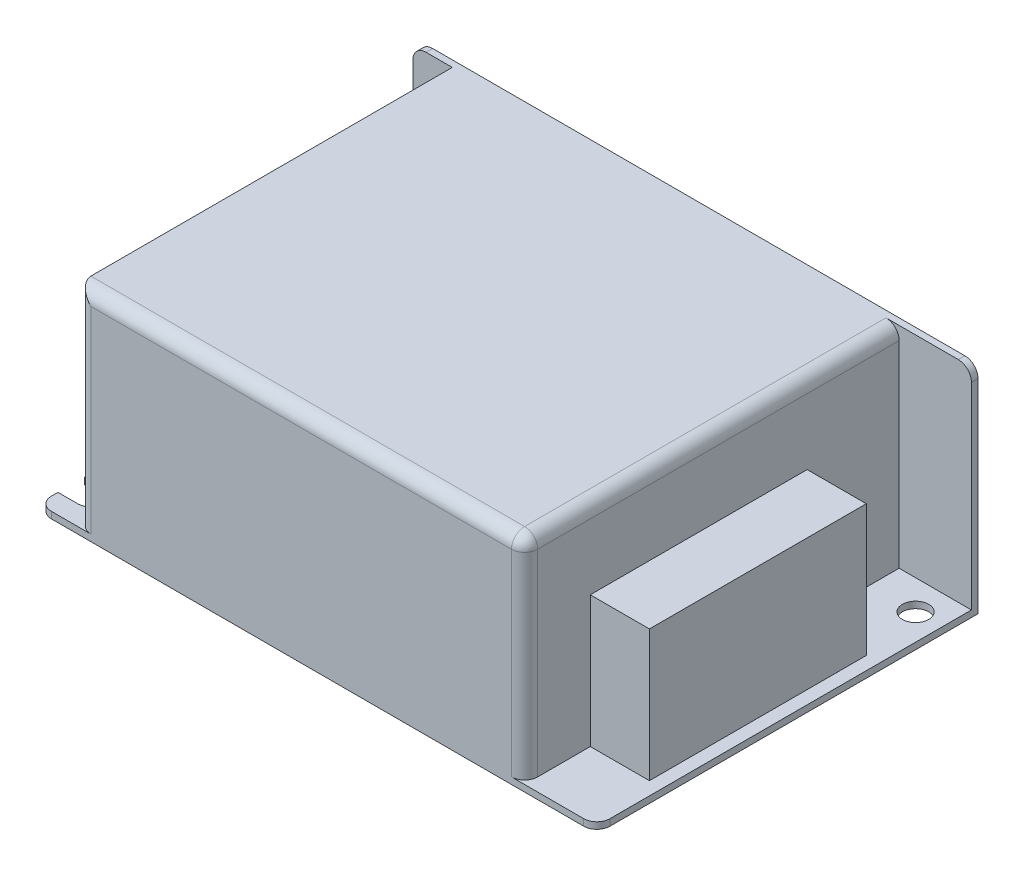
ISO-10303-21;
HEADER;
FILE_DESCRIPTION(('STEP AP214'),'2;1');
FILE_NAME('part.step','',(''),(''),'','','');
FILE_SCHEMA(('AUTOMOTIVE_DESIGN { 1 0 10303 214 1 1 1 1 }'));
ENDSEC;
DATA;
#1=APPLICATION_CONTEXT('core data for automotive mechanical design processes');
#2=APPLICATION_PROTOCOL_DEFINITION('international standard','automotive_design',2000,#1);
#3=PRODUCT_CONTEXT('',#1,'mechanical');
#4=PRODUCT('Part','Part','',(#3));
#5=PRODUCT_RELATED_PRODUCT_CATEGORY('part','',(#4));
#6=PRODUCT_DEFINITION_FORMATION('','',#4);
#7=PRODUCT_DEFINITION_CONTEXT('part definition',#1,'design');
#8=PRODUCT_DEFINITION('design','',#6,#7);
#9=PRODUCT_DEFINITION_SHAPE('','',#8);
#10=(LENGTH_UNIT() NAMED_UNIT(*) SI_UNIT(.MILLI.,.METRE.));
#11=(NAMED_UNIT(*) PLANE_ANGLE_UNIT() SI_UNIT($,.RADIAN.));
#12=(NAMED_UNIT(*) SI_UNIT($,.STERADIAN.) SOLID_ANGLE_UNIT());
#13=UNCERTAINTY_MEASURE_WITH_UNIT(LENGTH_MEASURE(1.E-05),#10,'distance_accuracy_value','');
#14=(GEOMETRIC_REPRESENTATION_CONTEXT(3) GLOBAL_UNCERTAINTY_ASSIGNED_CONTEXT((#13)) GLOBAL_UNIT_ASSIGNED_CONTEXT((#10,
#11,#12)) REPRESENTATION_CONTEXT('',''));
#15=CARTESIAN_POINT('',(0.,0.,0.));
#16=DIRECTION('',(0.,0.,1.));
#17=DIRECTION('',(1.,0.,0.));
#18=AXIS2_PLACEMENT_3D('',#15,#16,#17);
#19=CARTESIAN_POINT('',(-42.5,33.,29.));
#20=DIRECTION('',(1.,0.,0.));
#21=DIRECTION('',(0.,0.,-1.));
#22=AXIS2_PLACEMENT_3D('',#19,#20,#21);
#23=PLANE('',#22);
#24=DIRECTION('',(0.,1.,0.));
#25=VECTOR('',#24,1.);
#26=CARTESIAN_POINT('',(-42.5,-57.3149195236284,-28.));
#27=LINE('',#26,#25);
#28=CARTESIAN_POINT('',(-42.5,1.,-28.));
#29=VERTEX_POINT('',#28);
#30=CARTESIAN_POINT('',(-42.5,31.,-28.));
#31=VERTEX_POINT('',#30);
#32=EDGE_CURVE('E289',#29,#31,#27,.T.);
#33=ORIENTED_EDGE('',*,*,#32,.T.);
#34=DIRECTION('',(0.,0.,1.));
#35=VECTOR('',#34,1.);
#36=CARTESIAN_POINT('',(-42.5,31.,29.));
#37=LINE('',#36,#35);
#38=CARTESIAN_POINT('',(-42.5,31.,-29.));
#39=VERTEX_POINT('',#38);
#40=EDGE_CURVE('E58',#31,#39,#37,.F.);
#41=ORIENTED_EDGE('',*,*,#40,.T.);
#42=DIRECTION('',(0.,-1.,0.));
#43=VECTOR('',#42,1.);
#44=CARTESIAN_POINT('',(-42.5,33.,-29.));
#45=LINE('',#44,#43);
#46=CARTESIAN_POINT('',(-42.5,0.,-29.));
#47=VERTEX_POINT('',#46);
#48=EDGE_CURVE('E318',#39,#47,#45,.T.);
#49=ORIENTED_EDGE('',*,*,#48,.T.);
#50=DIRECTION('',(0.,0.,1.));
#51=VECTOR('',#50,1.);
#52=CARTESIAN_POINT('',(-42.5,0.,29.));
#53=LINE('',#52,#51);
#54=CARTESIAN_POINT('',(-42.5,0.,22.));
#55=VERTEX_POINT('',#54);
#56=EDGE_CURVE('E326',#47,#55,#53,.T.);
#57=ORIENTED_EDGE('',*,*,#56,.T.);
#58=DIRECTION('',(0.,-1.,0.));
#59=VECTOR('',#58,1.);
#60=CARTESIAN_POINT('',(-42.5,33.001,22.));
#61=LINE('',#60,#59);
#62=CARTESIAN_POINT('',(-42.5,1.,22.));
#63=VERTEX_POINT('',#62);
#64=EDGE_CURVE('E228',#63,#55,#61,.T.);
#65=ORIENTED_EDGE('',*,*,#64,.F.);
#66=DIRECTION('',(0.,0.,1.));
#67=VECTOR('',#66,1.);
#68=CARTESIAN_POINT('',(-42.5,1.,29.));
#69=LINE('',#68,#67);
#70=EDGE_CURVE('E235',#29,#63,#69,.T.);
#71=ORIENTED_EDGE('',*,*,#70,.F.);
#72=EDGE_LOOP('',(#33,#41,#49,#57,#65,#71));
#73=FACE_BOUND('',#72,.T.);
#74=ADVANCED_FACE('F41',(#73),#23,.F.);
#75=CARTESIAN_POINT('',(0.,0.,0.));
#76=DIRECTION('',(0.,-1.,0.));
#77=DIRECTION('',(0.,0.,-1.));
#78=AXIS2_PLACEMENT_3D('',#75,#76,#77);
#79=PLANE('',#78);
#80=CARTESIAN_POINT('',(38.5,0.,-23.5));
#81=DIRECTION('',(0.,-1.,0.));
#82=DIRECTION('',(0.,0.,-1.));
#83=AXIS2_PLACEMENT_3D('',#80,#81,#82);
#84=CIRCLE('',#83,2.);
#85=CARTESIAN_POINT('',(38.5,0.,-25.5));
#86=VERTEX_POINT('',#85);
#87=EDGE_CURVE('E245',#86,#86,#84,.T.);
#88=ORIENTED_EDGE('',*,*,#87,.F.);
#89=EDGE_LOOP('',(#88));
#90=FACE_BOUND('',#89,.T.);
#91=DIRECTION('',(0.,0.,-1.));
#92=VECTOR('',#91,1.);
#93=CARTESIAN_POINT('',(42.5,0.,29.));
#94=LINE('',#93,#92);
#95=CARTESIAN_POINT('',(42.5,0.,27.));
#96=VERTEX_POINT('',#95);
#97=CARTESIAN_POINT('',(42.5,0.,-29.));
#98=VERTEX_POINT('',#97);
#99=EDGE_CURVE('E314',#96,#98,#94,.T.);
#100=ORIENTED_EDGE('',*,*,#99,.F.);
#101=CARTESIAN_POINT('',(40.5,0.,27.));
#102=DIRECTION('',(0.,-1.,0.));
#103=DIRECTION('',(0.,0.,-1.));
#104=AXIS2_PLACEMENT_3D('',#101,#102,#103);
#105=CIRCLE('',#104,2.);
#106=CARTESIAN_POINT('',(40.5,0.,29.));
#107=VERTEX_POINT('',#106);
#108=EDGE_CURVE('E341',#96,#107,#105,.T.);
#109=ORIENTED_EDGE('',*,*,#108,.T.);
#110=DIRECTION('',(1.,0.,0.));
#111=VECTOR('',#110,1.);
#112=CARTESIAN_POINT('',(-42.5,0.,29.));
#113=LINE('',#112,#111);
#114=CARTESIAN_POINT('',(-40.5,0.,29.));
#115=VERTEX_POINT('',#114);
#116=EDGE_CURVE('E319',#115,#107,#113,.T.);
#117=ORIENTED_EDGE('',*,*,#116,.F.);
#118=CARTESIAN_POINT('',(-40.5,0.,27.));
#119=DIRECTION('',(0.,-1.,0.));
#120=DIRECTION('',(0.,0.,-1.));
#121=AXIS2_PLACEMENT_3D('',#118,#119,#120);
#122=CIRCLE('',#121,2.);
#123=CARTESIAN_POINT('',(-42.5,0.,27.));
#124=VERTEX_POINT('',#123);
#125=EDGE_CURVE('E339',#115,#124,#122,.T.);
#126=ORIENTED_EDGE('',*,*,#125,.T.);
#127=CARTESIAN_POINT('',(-42.5,0.,26.));
#128=VERTEX_POINT('',#127);
#129=EDGE_CURVE('E325',#128,#124,#53,.T.);
#130=ORIENTED_EDGE('',*,*,#129,.F.);
#131=DIRECTION('',(-1.,0.,0.));
#132=VECTOR('',#131,1.);
#133=CARTESIAN_POINT('',(-39.5,0.,26.));
#134=LINE('',#133,#132);
#135=CARTESIAN_POINT('',(-39.5,0.,26.));
#136=VERTEX_POINT('',#135);
#137=EDGE_CURVE('E238',#136,#128,#134,.T.);
#138=ORIENTED_EDGE('',*,*,#137,.F.);
#139=CARTESIAN_POINT('',(-39.5,0.,24.));
#140=DIRECTION('',(0.,-1.,0.));
#141=DIRECTION('',(0.,0.,-1.));
#142=AXIS2_PLACEMENT_3D('',#139,#140,#141);
#143=CIRCLE('',#142,2.);
#144=CARTESIAN_POINT('',(-39.5,0.,22.));
#145=VERTEX_POINT('',#144);
#146=EDGE_CURVE('E236',#145,#136,#143,.T.);
#147=ORIENTED_EDGE('',*,*,#146,.F.);
#148=DIRECTION('',(-1.,0.,0.));
#149=VECTOR('',#148,1.);
#150=CARTESIAN_POINT('',(-39.5,0.,22.));
#151=LINE('',#150,#149);
#152=EDGE_CURVE('E215',#145,#55,#151,.T.);
#153=ORIENTED_EDGE('',*,*,#152,.T.);
#154=ORIENTED_EDGE('',*,*,#56,.F.);
#155=DIRECTION('',(-1.,0.,0.));
#156=VECTOR('',#155,1.);
#157=CARTESIAN_POINT('',(-42.5,0.,-29.));
#158=LINE('',#157,#156);
#159=EDGE_CURVE('E322',#98,#47,#158,.T.);
#160=ORIENTED_EDGE('',*,*,#159,.F.);
#161=EDGE_LOOP('',(#100,#109,#117,#126,#130,#138,#147,#153,#154,#160));
#162=FACE_BOUND('',#161,.T.);
#163=ADVANCED_FACE('F419',(#90,#162),#79,.T.);
#164=CARTESIAN_POINT('',(0.,1.,0.));
#165=DIRECTION('',(0.,-1.,0.));
#166=DIRECTION('',(0.,0.,-1.));
#167=AXIS2_PLACEMENT_3D('',#164,#165,#166);
#168=PLANE('',#167);
#169=CARTESIAN_POINT('',(-42.5,1.,26.));
#170=VERTEX_POINT('',#169);
#171=CARTESIAN_POINT('',(-42.5,1.,27.));
#172=VERTEX_POINT('',#171);
#173=EDGE_CURVE('E286',#170,#172,#69,.T.);
#174=ORIENTED_EDGE('',*,*,#173,.T.);
#175=CARTESIAN_POINT('',(-40.5,1.,27.));
#176=DIRECTION('',(0.,-1.,0.));
#177=DIRECTION('',(0.,0.,-1.));
#178=AXIS2_PLACEMENT_3D('',#175,#176,#177);
#179=CIRCLE('',#178,2.);
#180=CARTESIAN_POINT('',(-40.5,1.,29.));
#181=VERTEX_POINT('',#180);
#182=EDGE_CURVE('E359',#172,#181,#179,.F.);
#183=ORIENTED_EDGE('',*,*,#182,.T.);
#184=DIRECTION('',(1.,0.,0.));
#185=VECTOR('',#184,1.);
#186=CARTESIAN_POINT('',(-42.5,1.,29.));
#187=LINE('',#186,#185);
#188=CARTESIAN_POINT('',(-34.5,1.,29.));
#189=VERTEX_POINT('',#188);
#190=EDGE_CURVE('E280',#181,#189,#187,.T.);
#191=ORIENTED_EDGE('',*,*,#190,.T.);
#192=CARTESIAN_POINT('',(-34.5,1.,27.));
#193=DIRECTION('',(0.,-1.,0.));
#194=DIRECTION('',(0.,0.,-1.));
#195=AXIS2_PLACEMENT_3D('',#192,#193,#194);
#196=CIRCLE('',#195,2.);
#197=CARTESIAN_POINT('',(-36.5,1.,27.));
#198=VERTEX_POINT('',#197);
#199=EDGE_CURVE('E387',#189,#198,#196,.T.);
#200=ORIENTED_EDGE('',*,*,#199,.T.);
#201=DIRECTION('',(0.,0.,-1.));
#202=VECTOR('',#201,1.);
#203=CARTESIAN_POINT('',(-36.5,1.,29.));
#204=LINE('',#203,#202);
#205=CARTESIAN_POINT('',(-36.5,1.,-28.));
#206=VERTEX_POINT('',#205);
#207=EDGE_CURVE('E283',#198,#206,#204,.T.);
#208=ORIENTED_EDGE('',*,*,#207,.T.);
#209=DIRECTION('',(-1.,0.,0.));
#210=VECTOR('',#209,1.);
#211=CARTESIAN_POINT('',(-42.5,1.,-28.));
#212=LINE('',#211,#210);
#213=EDGE_CURVE('E287',#206,#29,#212,.T.);
#214=ORIENTED_EDGE('',*,*,#213,.T.);
#215=ORIENTED_EDGE('',*,*,#70,.T.);
#216=DIRECTION('',(1.,0.,0.));
#217=VECTOR('',#216,1.);
#218=CARTESIAN_POINT('',(-39.5,1.,22.));
#219=LINE('',#218,#217);
#220=CARTESIAN_POINT('',(-39.5,1.,22.));
#221=VERTEX_POINT('',#220);
#222=EDGE_CURVE('E212',#63,#221,#219,.T.);
#223=ORIENTED_EDGE('',*,*,#222,.T.);
#224=CARTESIAN_POINT('',(-39.5,1.,24.));
#225=DIRECTION('',(0.,-1.,0.));
#226=DIRECTION('',(0.,0.,-1.));
#227=AXIS2_PLACEMENT_3D('',#224,#225,#226);
#228=CIRCLE('',#227,2.);
#229=CARTESIAN_POINT('',(-39.5,1.,26.));
#230=VERTEX_POINT('',#229);
#231=EDGE_CURVE('E223',#230,#221,#228,.F.);
#232=ORIENTED_EDGE('',*,*,#231,.F.);
#233=DIRECTION('',(1.,0.,0.));
#234=VECTOR('',#233,1.);
#235=CARTESIAN_POINT('',(-39.5,1.,26.));
#236=LINE('',#235,#234);
#237=EDGE_CURVE('E220',#170,#230,#236,.T.);
#238=ORIENTED_EDGE('',*,*,#237,.F.);
#239=EDGE_LOOP('',(#174,#183,#191,#200,#208,#214,#215,#223,#232,#238));
#240=FACE_BOUND('',#239,.T.);
#241=ADVANCED_FACE('F232',(#240),#168,.F.);
#242=CARTESIAN_POINT('',(0.,1.,0.));
#243=DIRECTION('',(0.,-1.,0.));
#244=DIRECTION('',(0.,0.,-1.));
#245=AXIS2_PLACEMENT_3D('',#242,#243,#244);
#246=PLANE('',#245);
#247=CARTESIAN_POINT('',(38.5,1.,-23.5));
#248=DIRECTION('',(0.,-1.,0.));
#249=DIRECTION('',(0.,0.,-1.));
#250=AXIS2_PLACEMENT_3D('',#247,#248,#249);
#251=CIRCLE('',#250,2.);
#252=CARTESIAN_POINT('',(38.5,1.,-25.5));
#253=VERTEX_POINT('',#252);
#254=EDGE_CURVE('E262',#253,#253,#251,.F.);
#255=ORIENTED_EDGE('',*,*,#254,.F.);
#256=EDGE_LOOP('',(#255));
#257=FACE_BOUND('',#256,.T.);
#258=DIRECTION('',(1.,0.,0.));
#259=VECTOR('',#258,1.);
#260=CARTESIAN_POINT('',(42.5,1.,29.));
#261=LINE('',#260,#259);
#262=CARTESIAN_POINT('',(29.5,1.,29.));
#263=VERTEX_POINT('',#262);
#264=CARTESIAN_POINT('',(40.5,1.,29.));
#265=VERTEX_POINT('',#264);
#266=EDGE_CURVE('E303',#263,#265,#261,.T.);
#267=ORIENTED_EDGE('',*,*,#266,.T.);
#268=CARTESIAN_POINT('',(40.5,1.,27.));
#269=DIRECTION('',(0.,-1.,0.));
#270=DIRECTION('',(0.,0.,-1.));
#271=AXIS2_PLACEMENT_3D('',#268,#269,#270);
#272=CIRCLE('',#271,2.);
#273=CARTESIAN_POINT('',(42.5,1.,27.));
#274=VERTEX_POINT('',#273);
#275=EDGE_CURVE('E355',#265,#274,#272,.F.);
#276=ORIENTED_EDGE('',*,*,#275,.T.);
#277=DIRECTION('',(0.,0.,-1.));
#278=VECTOR('',#277,1.);
#279=CARTESIAN_POINT('',(42.5,1.,29.));
#280=LINE('',#279,#278);
#281=CARTESIAN_POINT('',(42.5,1.,-28.));
#282=VERTEX_POINT('',#281);
#283=EDGE_CURVE('E300',#274,#282,#280,.T.);
#284=ORIENTED_EDGE('',*,*,#283,.T.);
#285=DIRECTION('',(-1.,0.,0.));
#286=VECTOR('',#285,1.);
#287=CARTESIAN_POINT('',(42.5,1.,-28.));
#288=LINE('',#287,#286);
#289=CARTESIAN_POINT('',(31.5,1.,-28.));
#290=VERTEX_POINT('',#289);
#291=EDGE_CURVE('E296',#282,#290,#288,.T.);
#292=ORIENTED_EDGE('',*,*,#291,.T.);
#293=DIRECTION('',(0.,0.,1.));
#294=VECTOR('',#293,1.);
#295=CARTESIAN_POINT('',(31.5,1.,29.));
#296=LINE('',#295,#294);
#297=CARTESIAN_POINT('',(31.5,1.,-14.));
#298=VERTEX_POINT('',#297);
#299=EDGE_CURVE('E306',#290,#298,#296,.T.);
#300=ORIENTED_EDGE('',*,*,#299,.T.);
#301=DIRECTION('',(-1.,0.,0.));
#302=VECTOR('',#301,1.);
#303=CARTESIAN_POINT('',(31.5,1.,-14.));
#304=LINE('',#303,#302);
#305=CARTESIAN_POINT('',(40.5,1.,-14.));
#306=VERTEX_POINT('',#305);
#307=EDGE_CURVE('E250',#306,#298,#304,.T.);
#308=ORIENTED_EDGE('',*,*,#307,.F.);
#309=DIRECTION('',(0.,0.,-1.));
#310=VECTOR('',#309,1.);
#311=CARTESIAN_POINT('',(40.5,1.,19.));
#312=LINE('',#311,#310);
#313=CARTESIAN_POINT('',(40.5,1.,19.));
#314=VERTEX_POINT('',#313);
#315=EDGE_CURVE('E261',#314,#306,#312,.T.);
#316=ORIENTED_EDGE('',*,*,#315,.F.);
#317=DIRECTION('',(1.,0.,0.));
#318=VECTOR('',#317,1.);
#319=CARTESIAN_POINT('',(31.5,1.,19.));
#320=LINE('',#319,#318);
#321=CARTESIAN_POINT('',(31.5,1.,19.));
#322=VERTEX_POINT('',#321);
#323=EDGE_CURVE('E258',#322,#314,#320,.T.);
#324=ORIENTED_EDGE('',*,*,#323,.F.);
#325=CARTESIAN_POINT('',(31.5,1.,27.));
#326=VERTEX_POINT('',#325);
#327=EDGE_CURVE('E309',#322,#326,#296,.T.);
#328=ORIENTED_EDGE('',*,*,#327,.T.);
#329=CARTESIAN_POINT('',(29.5,1.,27.));
#330=DIRECTION('',(0.,-1.,0.));
#331=DIRECTION('',(0.,0.,-1.));
#332=AXIS2_PLACEMENT_3D('',#329,#330,#331);
#333=CIRCLE('',#332,2.);
#334=EDGE_CURVE('E50',#326,#263,#333,.T.);
#335=ORIENTED_EDGE('',*,*,#334,.T.);
#336=EDGE_LOOP('',(#267,#276,#284,#292,#300,#308,#316,#324,#328,#335));
#337=FACE_BOUND('',#336,.T.);
#338=ADVANCED_FACE('F463',(#257,#337),#246,.F.);
#339=CARTESIAN_POINT('',(31.5,-58.0517010948,29.));
#340=DIRECTION('',(-1.,0.,0.));
#341=DIRECTION('',(0.,0.,1.));
#342=AXIS2_PLACEMENT_3D('',#339,#340,#341);
#343=PLANE('',#342);
#344=DIRECTION('',(0.,0.,1.));
#345=VECTOR('',#344,1.);
#346=CARTESIAN_POINT('',(31.5,31.,29.));
#347=LINE('',#346,#345);
#348=CARTESIAN_POINT('',(31.5,31.,-28.));
#349=VERTEX_POINT('',#348);
#350=CARTESIAN_POINT('',(31.5,31.,27.));
#351=VERTEX_POINT('',#350);
#352=EDGE_CURVE('E364',#349,#351,#347,.T.);
#353=ORIENTED_EDGE('',*,*,#352,.T.);
#354=DIRECTION('',(0.,1.,0.));
#355=VECTOR('',#354,1.);
#356=CARTESIAN_POINT('',(31.5,-58.0517010948,27.));
#357=LINE('',#356,#355);
#358=EDGE_CURVE('E366',#351,#326,#357,.F.);
#359=ORIENTED_EDGE('',*,*,#358,.T.);
#360=ORIENTED_EDGE('',*,*,#327,.F.);
#361=DIRECTION('',(0.,-1.,0.));
#362=VECTOR('',#361,1.);
#363=CARTESIAN_POINT('',(31.5,21.,19.));
#364=LINE('',#363,#362);
#365=CARTESIAN_POINT('',(31.5,21.,19.));
#366=VERTEX_POINT('',#365);
#367=EDGE_CURVE('E274',#366,#322,#364,.T.);
#368=ORIENTED_EDGE('',*,*,#367,.F.);
#369=DIRECTION('',(0.,0.,1.));
#370=VECTOR('',#369,1.);
#371=CARTESIAN_POINT('',(31.5,21.,19.));
#372=LINE('',#371,#370);
#373=CARTESIAN_POINT('',(31.5,21.,-14.));
#374=VERTEX_POINT('',#373);
#375=EDGE_CURVE('E246',#374,#366,#372,.T.);
#376=ORIENTED_EDGE('',*,*,#375,.F.);
#377=DIRECTION('',(0.,-1.,0.));
#378=VECTOR('',#377,1.);
#379=CARTESIAN_POINT('',(31.5,21.,-14.));
#380=LINE('',#379,#378);
#381=EDGE_CURVE('E257',#374,#298,#380,.T.);
#382=ORIENTED_EDGE('',*,*,#381,.T.);
#383=ORIENTED_EDGE('',*,*,#299,.F.);
#384=DIRECTION('',(0.,1.,0.));
#385=VECTOR('',#384,1.);
#386=CARTESIAN_POINT('',(31.5,-58.0517010948,-28.));
#387=LINE('',#386,#385);
#388=EDGE_CURVE('E299',#290,#349,#387,.T.);
#389=ORIENTED_EDGE('',*,*,#388,.T.);
#390=EDGE_LOOP('',(#353,#359,#360,#368,#376,#382,#383,#389));
#391=FACE_BOUND('',#390,.T.);
#392=ADVANCED_FACE('F459',(#391),#343,.F.);
#393=CARTESIAN_POINT('',(42.5,33.,29.));
#394=DIRECTION('',(-1.,0.,0.));
#395=DIRECTION('',(0.,0.,1.));
#396=AXIS2_PLACEMENT_3D('',#393,#394,#395);
#397=PLANE('',#396);
#398=ORIENTED_EDGE('',*,*,#283,.F.);
#399=DIRECTION('',(0.,-1.,0.));
#400=VECTOR('',#399,1.);
#401=CARTESIAN_POINT('',(42.5,33.,27.));
#402=LINE('',#401,#400);
#403=EDGE_CURVE('E336',#274,#96,#402,.T.);
#404=ORIENTED_EDGE('',*,*,#403,.T.);
#405=ORIENTED_EDGE('',*,*,#99,.T.);
#406=DIRECTION('',(0.,-1.,0.));
#407=VECTOR('',#406,1.);
#408=CARTESIAN_POINT('',(42.5,33.,-29.));
#409=LINE('',#408,#407);
#410=CARTESIAN_POINT('',(42.5,31.,-29.));
#411=VERTEX_POINT('',#410);
#412=EDGE_CURVE('E332',#411,#98,#409,.T.);
#413=ORIENTED_EDGE('',*,*,#412,.F.);
#414=DIRECTION('',(0.,0.,-1.));
#415=VECTOR('',#414,1.);
#416=CARTESIAN_POINT('',(42.5,31.,29.));
#417=LINE('',#416,#415);
#418=CARTESIAN_POINT('',(42.5,31.,-28.));
#419=VERTEX_POINT('',#418);
#420=EDGE_CURVE('E334',#411,#419,#417,.F.);
#421=ORIENTED_EDGE('',*,*,#420,.T.);
#422=DIRECTION('',(0.,1.,0.));
#423=VECTOR('',#422,1.);
#424=CARTESIAN_POINT('',(42.5,-58.0517010948,-28.));
#425=LINE('',#424,#423);
#426=EDGE_CURVE('E302',#282,#419,#425,.T.);
#427=ORIENTED_EDGE('',*,*,#426,.F.);
#428=EDGE_LOOP('',(#398,#404,#405,#413,#421,#427));
#429=FACE_BOUND('',#428,.T.);
#430=ADVANCED_FACE('F487',(#429),#397,.F.);
#431=CARTESIAN_POINT('',(-42.5,33.,-29.));
#432=DIRECTION('',(0.,0.,1.));
#433=DIRECTION('',(1.,0.,0.));
#434=AXIS2_PLACEMENT_3D('',#431,#432,#433);
#435=PLANE('',#434);
#436=ORIENTED_EDGE('',*,*,#48,.F.);
#437=CARTESIAN_POINT('',(-40.5,31.,-29.));
#438=DIRECTION('',(0.,0.,1.));
#439=DIRECTION('',(1.,0.,0.));
#440=AXIS2_PLACEMENT_3D('',#437,#438,#439);
#441=CIRCLE('',#440,2.);
#442=CARTESIAN_POINT('',(-40.5,33.,-29.));
#443=VERTEX_POINT('',#442);
#444=EDGE_CURVE('E383',#39,#443,#441,.F.);
#445=ORIENTED_EDGE('',*,*,#444,.T.);
#446=DIRECTION('',(-1.,0.,0.));
#447=VECTOR('',#446,1.);
#448=CARTESIAN_POINT('',(-42.5,33.,-29.));
#449=LINE('',#448,#447);
#450=CARTESIAN_POINT('',(40.5,33.,-29.));
#451=VERTEX_POINT('',#450);
#452=EDGE_CURVE('E315',#451,#443,#449,.T.);
#453=ORIENTED_EDGE('',*,*,#452,.F.);
#454=CARTESIAN_POINT('',(40.5,31.,-29.));
#455=DIRECTION('',(0.,0.,1.));
#456=DIRECTION('',(1.,0.,0.));
#457=AXIS2_PLACEMENT_3D('',#454,#455,#456);
#458=CIRCLE('',#457,2.);
#459=EDGE_CURVE('E381',#451,#411,#458,.F.);
#460=ORIENTED_EDGE('',*,*,#459,.T.);
#461=ORIENTED_EDGE('',*,*,#412,.T.);
#462=ORIENTED_EDGE('',*,*,#159,.T.);
#463=EDGE_LOOP('',(#436,#445,#453,#460,#461,#462));
#464=FACE_BOUND('',#463,.T.);
#465=ADVANCED_FACE('F493',(#464),#435,.F.);
#466=ORIENTED_EDGE('',*,*,#129,.T.);
#467=DIRECTION('',(0.,-1.,0.));
#468=VECTOR('',#467,1.);
#469=CARTESIAN_POINT('',(-42.5,33.,27.));
#470=LINE('',#469,#468);
#471=EDGE_CURVE('E357',#124,#172,#470,.F.);
#472=ORIENTED_EDGE('',*,*,#471,.T.);
#473=ORIENTED_EDGE('',*,*,#173,.F.);
#474=DIRECTION('',(0.,1.,0.));
#475=VECTOR('',#474,1.);
#476=CARTESIAN_POINT('',(-42.5,33.001,26.));
#477=LINE('',#476,#475);
#478=EDGE_CURVE('E243',#128,#170,#477,.T.);
#479=ORIENTED_EDGE('',*,*,#478,.F.);
#480=EDGE_LOOP('',(#466,#472,#473,#479));
#481=FACE_BOUND('',#480,.T.);
#482=ADVANCED_FACE('F416',(#481),#23,.F.);
#483=CARTESIAN_POINT('',(-42.5,33.,29.));
#484=DIRECTION('',(0.,0.,-1.));
#485=DIRECTION('',(-1.,0.,0.));
#486=AXIS2_PLACEMENT_3D('',#483,#484,#485);
#487=PLANE('',#486);
#488=ORIENTED_EDGE('',*,*,#116,.T.);
#489=DIRECTION('',(0.,-1.,0.));
#490=VECTOR('',#489,1.);
#491=CARTESIAN_POINT('',(40.5,33.,29.));
#492=LINE('',#491,#490);
#493=EDGE_CURVE('E353',#107,#265,#492,.F.);
#494=ORIENTED_EDGE('',*,*,#493,.T.);
#495=ORIENTED_EDGE('',*,*,#266,.F.);
#496=DIRECTION('',(0.,1.,0.));
#497=VECTOR('',#496,1.);
#498=CARTESIAN_POINT('',(29.5,33.,29.));
#499=LINE('',#498,#497);
#500=CARTESIAN_POINT('',(29.5,31.,29.));
#501=VERTEX_POINT('',#500);
#502=EDGE_CURVE('E345',#263,#501,#499,.T.);
#503=ORIENTED_EDGE('',*,*,#502,.T.);
#504=DIRECTION('',(1.,0.,0.));
#505=VECTOR('',#504,1.);
#506=CARTESIAN_POINT('',(-42.5,31.,29.));
#507=LINE('',#506,#505);
#508=CARTESIAN_POINT('',(-34.5,31.,29.));
#509=VERTEX_POINT('',#508);
#510=EDGE_CURVE('E343',#501,#509,#507,.F.);
#511=ORIENTED_EDGE('',*,*,#510,.T.);
#512=DIRECTION('',(0.,1.,0.));
#513=VECTOR('',#512,1.);
#514=CARTESIAN_POINT('',(-34.5,33.,29.));
#515=LINE('',#514,#513);
#516=EDGE_CURVE('E347',#509,#189,#515,.F.);
#517=ORIENTED_EDGE('',*,*,#516,.T.);
#518=ORIENTED_EDGE('',*,*,#190,.F.);
#519=DIRECTION('',(0.,-1.,0.));
#520=VECTOR('',#519,1.);
#521=CARTESIAN_POINT('',(-40.5,33.,29.));
#522=LINE('',#521,#520);
#523=EDGE_CURVE('E350',#181,#115,#522,.T.);
#524=ORIENTED_EDGE('',*,*,#523,.T.);
#525=EDGE_LOOP('',(#488,#494,#495,#503,#511,#517,#518,#524));
#526=FACE_BOUND('',#525,.T.);
#527=ADVANCED_FACE('F427',(#526),#487,.F.);
#528=CARTESIAN_POINT('',(0.,33.,0.));
#529=DIRECTION('',(0.,-1.,0.));
#530=DIRECTION('',(0.,0.,-1.));
#531=AXIS2_PLACEMENT_3D('',#528,#529,#530);
#532=PLANE('',#531);
#533=DIRECTION('',(0.,0.,-1.));
#534=VECTOR('',#533,1.);
#535=CARTESIAN_POINT('',(-36.5,33.,29.));
#536=LINE('',#535,#534);
#537=CARTESIAN_POINT('',(-36.5,33.,27.));
#538=VERTEX_POINT('',#537);
#539=CARTESIAN_POINT('',(-36.5,33.,-28.));
#540=VERTEX_POINT('',#539);
#541=EDGE_CURVE('E277',#538,#540,#536,.T.);
#542=ORIENTED_EDGE('',*,*,#541,.F.);
#543=DIRECTION('',(1.,0.,0.));
#544=VECTOR('',#543,1.);
#545=CARTESIAN_POINT('',(0.,33.,27.));
#546=LINE('',#545,#544);
#547=CARTESIAN_POINT('',(29.5,33.,27.));
#548=VERTEX_POINT('',#547);
#549=EDGE_CURVE('E377',#538,#548,#546,.T.);
#550=ORIENTED_EDGE('',*,*,#549,.T.);
#551=DIRECTION('',(0.,0.,1.));
#552=VECTOR('',#551,1.);
#553=CARTESIAN_POINT('',(29.5,33.,0.));
#554=LINE('',#553,#552);
#555=CARTESIAN_POINT('',(29.5,33.,-28.));
#556=VERTEX_POINT('',#555);
#557=EDGE_CURVE('E374',#548,#556,#554,.F.);
#558=ORIENTED_EDGE('',*,*,#557,.T.);
#559=DIRECTION('',(-1.,0.,0.));
#560=VECTOR('',#559,1.);
#561=CARTESIAN_POINT('',(42.5,33.,-28.));
#562=LINE('',#561,#560);
#563=CARTESIAN_POINT('',(40.5,33.,-28.));
#564=VERTEX_POINT('',#563);
#565=EDGE_CURVE('E285',#564,#556,#562,.T.);
#566=ORIENTED_EDGE('',*,*,#565,.F.);
#567=DIRECTION('',(0.,0.,-1.));
#568=VECTOR('',#567,1.);
#569=CARTESIAN_POINT('',(40.5,33.,0.));
#570=LINE('',#569,#568);
#571=EDGE_CURVE('E368',#564,#451,#570,.T.);
#572=ORIENTED_EDGE('',*,*,#571,.T.);
#573=ORIENTED_EDGE('',*,*,#452,.T.);
#574=DIRECTION('',(0.,0.,1.));
#575=VECTOR('',#574,1.);
#576=CARTESIAN_POINT('',(-40.5,33.,0.));
#577=LINE('',#576,#575);
#578=CARTESIAN_POINT('',(-40.5,33.,-28.));
#579=VERTEX_POINT('',#578);
#580=EDGE_CURVE('E371',#443,#579,#577,.T.);
#581=ORIENTED_EDGE('',*,*,#580,.T.);
#582=DIRECTION('',(-1.,0.,0.));
#583=VECTOR('',#582,1.);
#584=CARTESIAN_POINT('',(-42.5,33.,-28.));
#585=LINE('',#584,#583);
#586=EDGE_CURVE('E278',#540,#579,#585,.T.);
#587=ORIENTED_EDGE('',*,*,#586,.F.);
#588=EDGE_LOOP('',(#542,#550,#558,#566,#572,#573,#581,#587));
#589=FACE_BOUND('',#588,.T.);
#590=ADVANCED_FACE('F447',(#589),#532,.F.);
#591=CARTESIAN_POINT('',(42.5,-58.0517010948,-28.));
#592=DIRECTION('',(0.,0.,-1.));
#593=DIRECTION('',(-1.,0.,0.));
#594=AXIS2_PLACEMENT_3D('',#591,#592,#593);
#595=PLANE('',#594);
#596=ORIENTED_EDGE('',*,*,#426,.T.);
#597=CARTESIAN_POINT('',(40.5,31.,-28.));
#598=DIRECTION('',(0.,0.,-1.));
#599=DIRECTION('',(-1.,0.,0.));
#600=AXIS2_PLACEMENT_3D('',#597,#598,#599);
#601=CIRCLE('',#600,2.);
#602=EDGE_CURVE('E385',#419,#564,#601,.F.);
#603=ORIENTED_EDGE('',*,*,#602,.T.);
#604=ORIENTED_EDGE('',*,*,#565,.T.);
#605=CARTESIAN_POINT('',(29.5,31.,-28.));
#606=DIRECTION('',(0.,0.,-1.));
#607=DIRECTION('',(-1.,0.,0.));
#608=AXIS2_PLACEMENT_3D('',#605,#606,#607);
#609=CIRCLE('',#608,2.);
#610=EDGE_CURVE('E13',#556,#349,#609,.T.);
#611=ORIENTED_EDGE('',*,*,#610,.T.);
#612=ORIENTED_EDGE('',*,*,#388,.F.);
#613=ORIENTED_EDGE('',*,*,#291,.F.);
#614=EDGE_LOOP('',(#596,#603,#604,#611,#612,#613));
#615=FACE_BOUND('',#614,.T.);
#616=ADVANCED_FACE('F456',(#615),#595,.F.);
#617=CARTESIAN_POINT('',(-36.5,-57.3149195236284,29.));
#618=DIRECTION('',(1.,0.,0.));
#619=DIRECTION('',(0.,0.,-1.));
#620=AXIS2_PLACEMENT_3D('',#617,#618,#619);
#621=PLANE('',#620);
#622=ORIENTED_EDGE('',*,*,#207,.F.);
#623=DIRECTION('',(0.,1.,0.));
#624=VECTOR('',#623,1.);
#625=CARTESIAN_POINT('',(-36.5,-57.3149195236284,27.));
#626=LINE('',#625,#624);
#627=EDGE_CURVE('E361',#198,#538,#626,.T.);
#628=ORIENTED_EDGE('',*,*,#627,.T.);
#629=ORIENTED_EDGE('',*,*,#541,.T.);
#630=DIRECTION('',(0.,1.,0.));
#631=VECTOR('',#630,1.);
#632=CARTESIAN_POINT('',(-36.5,-57.3149195236284,-28.));
#633=LINE('',#632,#631);
#634=EDGE_CURVE('E290',#206,#540,#633,.T.);
#635=ORIENTED_EDGE('',*,*,#634,.F.);
#636=EDGE_LOOP('',(#622,#628,#629,#635));
#637=FACE_BOUND('',#636,.T.);
#638=ADVANCED_FACE('F437',(#637),#621,.F.);
#639=CARTESIAN_POINT('',(-42.5,-57.3149195236284,-28.));
#640=DIRECTION('',(0.,0.,-1.));
#641=DIRECTION('',(-1.,0.,0.));
#642=AXIS2_PLACEMENT_3D('',#639,#640,#641);
#643=PLANE('',#642);
#644=ORIENTED_EDGE('',*,*,#586,.T.);
#645=CARTESIAN_POINT('',(-40.5,31.,-28.));
#646=DIRECTION('',(0.,0.,-1.));
#647=DIRECTION('',(-1.,0.,0.));
#648=AXIS2_PLACEMENT_3D('',#645,#646,#647);
#649=CIRCLE('',#648,2.);
#650=EDGE_CURVE('E66',#579,#31,#649,.F.);
#651=ORIENTED_EDGE('',*,*,#650,.T.);
#652=ORIENTED_EDGE('',*,*,#32,.F.);
#653=ORIENTED_EDGE('',*,*,#213,.F.);
#654=ORIENTED_EDGE('',*,*,#634,.T.);
#655=EDGE_LOOP('',(#644,#651,#652,#653,#654));
#656=FACE_BOUND('',#655,.T.);
#657=ADVANCED_FACE('F503',(#656),#643,.F.);
#658=CARTESIAN_POINT('',(31.5,21.,19.));
#659=DIRECTION('',(0.,0.,-1.));
#660=DIRECTION('',(-1.,0.,0.));
#661=AXIS2_PLACEMENT_3D('',#658,#659,#660);
#662=PLANE('',#661);
#663=ORIENTED_EDGE('',*,*,#323,.T.);
#664=DIRECTION('',(0.,-1.,0.));
#665=VECTOR('',#664,1.);
#666=CARTESIAN_POINT('',(40.5,21.,19.));
#667=LINE('',#666,#665);
#668=CARTESIAN_POINT('',(40.5,21.,19.));
#669=VERTEX_POINT('',#668);
#670=EDGE_CURVE('E271',#669,#314,#667,.T.);
#671=ORIENTED_EDGE('',*,*,#670,.F.);
#672=DIRECTION('',(1.,0.,0.));
#673=VECTOR('',#672,1.);
#674=CARTESIAN_POINT('',(31.5,21.,19.));
#675=LINE('',#674,#673);
#676=EDGE_CURVE('E249',#366,#669,#675,.T.);
#677=ORIENTED_EDGE('',*,*,#676,.F.);
#678=ORIENTED_EDGE('',*,*,#367,.T.);
#679=EDGE_LOOP('',(#663,#671,#677,#678));
#680=FACE_BOUND('',#679,.T.);
#681=ADVANCED_FACE('F475',(#680),#662,.F.);
#682=CARTESIAN_POINT('',(40.5,21.,19.));
#683=DIRECTION('',(-1.,0.,0.));
#684=DIRECTION('',(0.,0.,1.));
#685=AXIS2_PLACEMENT_3D('',#682,#683,#684);
#686=PLANE('',#685);
#687=ORIENTED_EDGE('',*,*,#315,.T.);
#688=DIRECTION('',(0.,-1.,0.));
#689=VECTOR('',#688,1.);
#690=CARTESIAN_POINT('',(40.5,21.,-14.));
#691=LINE('',#690,#689);
#692=CARTESIAN_POINT('',(40.5,21.,-14.));
#693=VERTEX_POINT('',#692);
#694=EDGE_CURVE('E268',#693,#306,#691,.T.);
#695=ORIENTED_EDGE('',*,*,#694,.F.);
#696=DIRECTION('',(0.,0.,-1.));
#697=VECTOR('',#696,1.);
#698=CARTESIAN_POINT('',(40.5,21.,19.));
#699=LINE('',#698,#697);
#700=EDGE_CURVE('E252',#669,#693,#699,.T.);
#701=ORIENTED_EDGE('',*,*,#700,.F.);
#702=ORIENTED_EDGE('',*,*,#670,.T.);
#703=EDGE_LOOP('',(#687,#695,#701,#702));
#704=FACE_BOUND('',#703,.T.);
#705=ADVANCED_FACE('F470',(#704),#686,.F.);
#706=CARTESIAN_POINT('',(31.5,21.,-14.));
#707=DIRECTION('',(0.,0.,1.));
#708=DIRECTION('',(1.,0.,0.));
#709=AXIS2_PLACEMENT_3D('',#706,#707,#708);
#710=PLANE('',#709);
#711=ORIENTED_EDGE('',*,*,#307,.T.);
#712=ORIENTED_EDGE('',*,*,#381,.F.);
#713=DIRECTION('',(-1.,0.,0.));
#714=VECTOR('',#713,1.);
#715=CARTESIAN_POINT('',(31.5,21.,-14.));
#716=LINE('',#715,#714);
#717=EDGE_CURVE('E254',#693,#374,#716,.T.);
#718=ORIENTED_EDGE('',*,*,#717,.F.);
#719=ORIENTED_EDGE('',*,*,#694,.T.);
#720=EDGE_LOOP('',(#711,#712,#718,#719));
#721=FACE_BOUND('',#720,.T.);
#722=ADVANCED_FACE('F465',(#721),#710,.F.);
#723=CARTESIAN_POINT('',(0.,21.,0.));
#724=DIRECTION('',(0.,-1.,0.));
#725=DIRECTION('',(0.,0.,-1.));
#726=AXIS2_PLACEMENT_3D('',#723,#724,#725);
#727=PLANE('',#726);
#728=ORIENTED_EDGE('',*,*,#375,.T.);
#729=ORIENTED_EDGE('',*,*,#676,.T.);
#730=ORIENTED_EDGE('',*,*,#700,.T.);
#731=ORIENTED_EDGE('',*,*,#717,.T.);
#732=EDGE_LOOP('',(#728,#729,#730,#731));
#733=FACE_BOUND('',#732,.T.);
#734=ADVANCED_FACE('F715',(#733),#727,.F.);
#735=CARTESIAN_POINT('',(-39.5,33.001,24.));
#736=DIRECTION('',(0.,-1.,0.));
#737=DIRECTION('',(0.,0.,-1.));
#738=AXIS2_PLACEMENT_3D('',#735,#736,#737);
#739=CYLINDRICAL_SURFACE('',#738,2.);
#740=ORIENTED_EDGE('',*,*,#231,.T.);
#741=DIRECTION('',(0.,-1.,0.));
#742=VECTOR('',#741,1.);
#743=CARTESIAN_POINT('',(-39.5,33.001,22.));
#744=LINE('',#743,#742);
#745=EDGE_CURVE('E208',#221,#145,#744,.T.);
#746=ORIENTED_EDGE('',*,*,#745,.T.);
#747=ORIENTED_EDGE('',*,*,#146,.T.);
#748=DIRECTION('',(0.,-1.,0.));
#749=VECTOR('',#748,1.);
#750=CARTESIAN_POINT('',(-39.5,33.001,26.));
#751=LINE('',#750,#749);
#752=EDGE_CURVE('E219',#230,#136,#751,.T.);
#753=ORIENTED_EDGE('',*,*,#752,.F.);
#754=EDGE_LOOP('',(#740,#746,#747,#753));
#755=FACE_BOUND('',#754,.T.);
#756=ADVANCED_FACE('F224',(#755),#739,.F.);
#757=CARTESIAN_POINT('',(-39.5,33.001,22.));
#758=DIRECTION('',(0.,0.,1.));
#759=DIRECTION('',(1.,0.,0.));
#760=AXIS2_PLACEMENT_3D('',#757,#758,#759);
#761=PLANE('',#760);
#762=ORIENTED_EDGE('',*,*,#64,.T.);
#763=ORIENTED_EDGE('',*,*,#152,.F.);
#764=ORIENTED_EDGE('',*,*,#745,.F.);
#765=ORIENTED_EDGE('',*,*,#222,.F.);
#766=EDGE_LOOP('',(#762,#763,#764,#765));
#767=FACE_BOUND('',#766,.T.);
#768=ADVANCED_FACE('F210',(#767),#761,.T.);
#769=CARTESIAN_POINT('',(-39.5,33.001,26.));
#770=DIRECTION('',(0.,0.,1.));
#771=DIRECTION('',(1.,0.,0.));
#772=AXIS2_PLACEMENT_3D('',#769,#770,#771);
#773=PLANE('',#772);
#774=ORIENTED_EDGE('',*,*,#237,.T.);
#775=ORIENTED_EDGE('',*,*,#752,.T.);
#776=ORIENTED_EDGE('',*,*,#137,.T.);
#777=ORIENTED_EDGE('',*,*,#478,.T.);
#778=EDGE_LOOP('',(#774,#775,#776,#777));
#779=FACE_BOUND('',#778,.T.);
#780=ADVANCED_FACE('F410',(#779),#773,.F.);
#781=CARTESIAN_POINT('',(38.5,33.001,-23.5));
#782=DIRECTION('',(0.,-1.,0.));
#783=DIRECTION('',(0.,0.,-1.));
#784=AXIS2_PLACEMENT_3D('',#781,#782,#783);
#785=CYLINDRICAL_SURFACE('',#784,2.);
#786=ORIENTED_EDGE('',*,*,#87,.T.);
#787=EDGE_LOOP('',(#786));
#788=FACE_BOUND('',#787,.T.);
#789=ORIENTED_EDGE('',*,*,#254,.T.);
#790=EDGE_LOOP('',(#789));
#791=FACE_BOUND('',#790,.T.);
#792=ADVANCED_FACE('F525',(#788,#791),#785,.F.);
#793=CARTESIAN_POINT('',(40.5,33.,27.));
#794=DIRECTION('',(0.,-1.,0.));
#795=DIRECTION('',(0.,0.,-1.));
#796=AXIS2_PLACEMENT_3D('',#793,#794,#795);
#797=CYLINDRICAL_SURFACE('',#796,2.);
#798=ORIENTED_EDGE('',*,*,#275,.F.);
#799=ORIENTED_EDGE('',*,*,#493,.F.);
#800=ORIENTED_EDGE('',*,*,#108,.F.);
#801=ORIENTED_EDGE('',*,*,#403,.F.);
#802=EDGE_LOOP('',(#798,#799,#800,#801));
#803=FACE_BOUND('',#802,.T.);
#804=ADVANCED_FACE('F485',(#803),#797,.T.);
#805=CARTESIAN_POINT('',(-40.5,33.,27.));
#806=DIRECTION('',(0.,-1.,0.));
#807=DIRECTION('',(0.,0.,-1.));
#808=AXIS2_PLACEMENT_3D('',#805,#806,#807);
#809=CYLINDRICAL_SURFACE('',#808,2.);
#810=ORIENTED_EDGE('',*,*,#182,.F.);
#811=ORIENTED_EDGE('',*,*,#471,.F.);
#812=ORIENTED_EDGE('',*,*,#125,.F.);
#813=ORIENTED_EDGE('',*,*,#523,.F.);
#814=EDGE_LOOP('',(#810,#811,#812,#813));
#815=FACE_BOUND('',#814,.T.);
#816=ADVANCED_FACE('F424',(#815),#809,.T.);
#817=CARTESIAN_POINT('',(29.5,31.,29.));
#818=DIRECTION('',(0.,0.,1.));
#819=DIRECTION('',(1.,0.,0.));
#820=AXIS2_PLACEMENT_3D('',#817,#818,#819);
#821=CYLINDRICAL_SURFACE('',#820,2.);
#822=ORIENTED_EDGE('',*,*,#610,.F.);
#823=ORIENTED_EDGE('',*,*,#557,.F.);
#824=CARTESIAN_POINT('',(29.5,31.,27.));
#825=DIRECTION('',(0.,0.,1.));
#826=DIRECTION('',(1.,0.,0.));
#827=AXIS2_PLACEMENT_3D('',#824,#825,#826);
#828=CIRCLE('',#827,2.);
#829=EDGE_CURVE('E45',#351,#548,#828,.T.);
#830=ORIENTED_EDGE('',*,*,#829,.F.);
#831=ORIENTED_EDGE('',*,*,#352,.F.);
#832=EDGE_LOOP('',(#822,#823,#830,#831));
#833=FACE_BOUND('',#832,.T.);
#834=ADVANCED_FACE('F452',(#833),#821,.T.);
#835=CARTESIAN_POINT('',(29.5,33.,27.));
#836=DIRECTION('',(0.,1.,0.));
#837=DIRECTION('',(0.,0.,1.));
#838=AXIS2_PLACEMENT_3D('',#835,#836,#837);
#839=CYLINDRICAL_SURFACE('',#838,2.);
#840=ORIENTED_EDGE('',*,*,#334,.F.);
#841=ORIENTED_EDGE('',*,*,#358,.F.);
#842=CARTESIAN_POINT('',(29.5,31.,27.));
#843=DIRECTION('',(0.,1.,0.));
#844=DIRECTION('',(0.,0.,1.));
#845=AXIS2_PLACEMENT_3D('',#842,#843,#844);
#846=CIRCLE('',#845,2.);
#847=EDGE_CURVE('E395',#501,#351,#846,.T.);
#848=ORIENTED_EDGE('',*,*,#847,.F.);
#849=ORIENTED_EDGE('',*,*,#502,.F.);
#850=EDGE_LOOP('',(#840,#841,#848,#849));
#851=FACE_BOUND('',#850,.T.);
#852=ADVANCED_FACE('F480',(#851),#839,.T.);
#853=CARTESIAN_POINT('',(29.5,31.,27.));
#854=DIRECTION('',(0.,0.,1.));
#855=DIRECTION('',(1.,0.,0.));
#856=AXIS2_PLACEMENT_3D('',#853,#854,#855);
#857=SPHERICAL_SURFACE('',#856,2.);
#858=ORIENTED_EDGE('',*,*,#847,.T.);
#859=ORIENTED_EDGE('',*,*,#829,.T.);
#860=CARTESIAN_POINT('',(29.5,31.,27.));
#861=DIRECTION('',(1.,0.,0.));
#862=DIRECTION('',(0.,0.,-1.));
#863=AXIS2_PLACEMENT_3D('',#860,#861,#862);
#864=CIRCLE('',#863,2.);
#865=EDGE_CURVE('E393',#501,#548,#864,.F.);
#866=ORIENTED_EDGE('',*,*,#865,.F.);
#867=EDGE_LOOP('',(#858,#859,#866));
#868=FACE_BOUND('',#867,.T.);
#869=ADVANCED_FACE('F532',(#868),#857,.T.);
#870=CARTESIAN_POINT('',(0.,31.,27.));
#871=DIRECTION('',(1.,0.,0.));
#872=DIRECTION('',(0.,0.,-1.));
#873=AXIS2_PLACEMENT_3D('',#870,#871,#872);
#874=CYLINDRICAL_SURFACE('',#873,2.);
#875=ORIENTED_EDGE('',*,*,#865,.T.);
#876=ORIENTED_EDGE('',*,*,#549,.F.);
#877=CARTESIAN_POINT('',(-34.5,31.,27.));
#878=DIRECTION('',(0.707106781186547,0.707106781186547,0.));
#879=DIRECTION('',(0.707106781186547,-0.707106781186547,0.));
#880=AXIS2_PLACEMENT_3D('',#877,#878,#879);
#881=ELLIPSE('',#880,2.82842712474619,2.);
#882=EDGE_CURVE('E391',#509,#538,#881,.F.);
#883=ORIENTED_EDGE('',*,*,#882,.F.);
#884=ORIENTED_EDGE('',*,*,#510,.F.);
#885=EDGE_LOOP('',(#875,#876,#883,#884));
#886=FACE_BOUND('',#885,.T.);
#887=ADVANCED_FACE('F444',(#886),#874,.T.);
#888=CARTESIAN_POINT('',(-34.5,-57.3149195236284,27.));
#889=DIRECTION('',(0.,1.,0.));
#890=DIRECTION('',(0.,0.,1.));
#891=AXIS2_PLACEMENT_3D('',#888,#889,#890);
#892=CYLINDRICAL_SURFACE('',#891,2.);
#893=ORIENTED_EDGE('',*,*,#199,.F.);
#894=ORIENTED_EDGE('',*,*,#516,.F.);
#895=ORIENTED_EDGE('',*,*,#882,.T.);
#896=ORIENTED_EDGE('',*,*,#627,.F.);
#897=EDGE_LOOP('',(#893,#894,#895,#896));
#898=FACE_BOUND('',#897,.T.);
#899=ADVANCED_FACE('F439',(#898),#892,.T.);
#900=CARTESIAN_POINT('',(-40.5,31.,0.));
#901=DIRECTION('',(0.,0.,1.));
#902=DIRECTION('',(1.,0.,0.));
#903=AXIS2_PLACEMENT_3D('',#900,#901,#902);
#904=CYLINDRICAL_SURFACE('',#903,2.);
#905=ORIENTED_EDGE('',*,*,#444,.F.);
#906=ORIENTED_EDGE('',*,*,#40,.F.);
#907=ORIENTED_EDGE('',*,*,#650,.F.);
#908=ORIENTED_EDGE('',*,*,#580,.F.);
#909=EDGE_LOOP('',(#905,#906,#907,#908));
#910=FACE_BOUND('',#909,.T.);
#911=ADVANCED_FACE('F502',(#910),#904,.T.);
#912=CARTESIAN_POINT('',(40.5,31.,0.));
#913=DIRECTION('',(0.,0.,-1.));
#914=DIRECTION('',(-1.,0.,0.));
#915=AXIS2_PLACEMENT_3D('',#912,#913,#914);
#916=CYLINDRICAL_SURFACE('',#915,2.);
#917=ORIENTED_EDGE('',*,*,#602,.F.);
#918=ORIENTED_EDGE('',*,*,#420,.F.);
#919=ORIENTED_EDGE('',*,*,#459,.F.);
#920=ORIENTED_EDGE('',*,*,#571,.F.);
#921=EDGE_LOOP('',(#917,#918,#919,#920));
#922=FACE_BOUND('',#921,.T.);
#923=ADVANCED_FACE('F43',(#922),#916,.T.);
#924=CLOSED_SHELL('',(#74,#163,#241,#338,#392,#430,#465,#482,#527,#590,#616,#638,#657,#681,#705,
#722,#734,#756,#768,#780,#792,#804,#816,#834,#852,#869,#887,#899,#911,#923));
#925=MANIFOLD_SOLID_BREP('B2',#924);
#926=ADVANCED_BREP_SHAPE_REPRESENTATION('',(#18,#925),#14);
#927=SHAPE_DEFINITION_REPRESENTATION(#9,#926);
ENDSEC;
END-ISO-10303-21;
